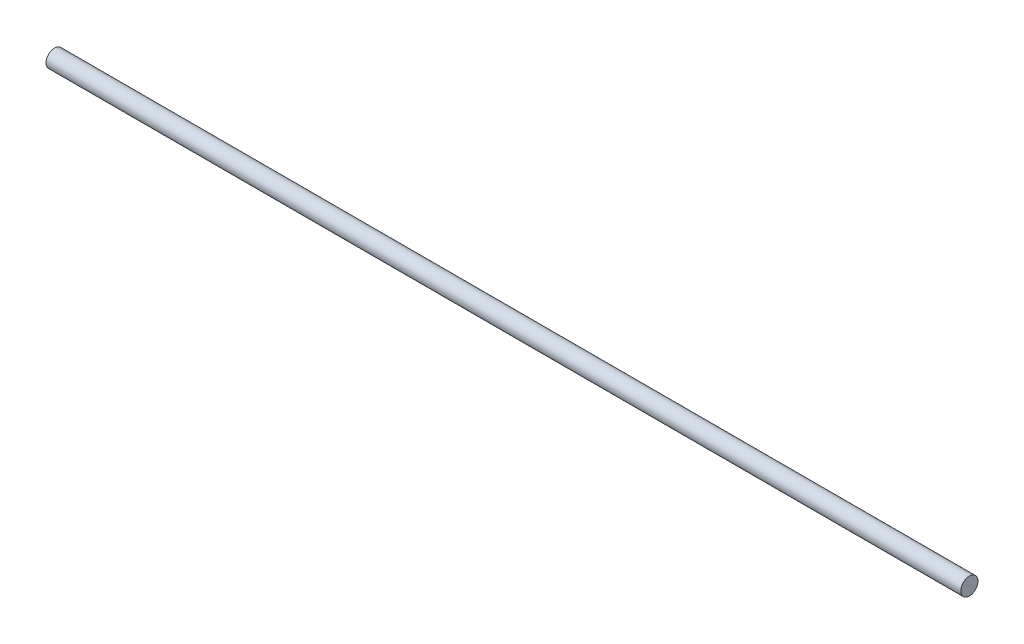
ISO-10303-21;
HEADER;
FILE_DESCRIPTION(('STEP AP214'),'2;1');
FILE_NAME('part.step','',(''),(''),'','','');
FILE_SCHEMA(('AUTOMOTIVE_DESIGN { 1 0 10303 214 1 1 1 1 }'));
ENDSEC;
DATA;
#1=APPLICATION_CONTEXT('core data for automotive mechanical design processes');
#2=APPLICATION_PROTOCOL_DEFINITION('international standard','automotive_design',2000,#1);
#3=PRODUCT_CONTEXT('',#1,'mechanical');
#4=PRODUCT('Part','Part','',(#3));
#5=PRODUCT_RELATED_PRODUCT_CATEGORY('part','',(#4));
#6=PRODUCT_DEFINITION_FORMATION('','',#4);
#7=PRODUCT_DEFINITION_CONTEXT('part definition',#1,'design');
#8=PRODUCT_DEFINITION('design','',#6,#7);
#9=PRODUCT_DEFINITION_SHAPE('','',#8);
#10=(LENGTH_UNIT() NAMED_UNIT(*) SI_UNIT(.MILLI.,.METRE.));
#11=(NAMED_UNIT(*) PLANE_ANGLE_UNIT() SI_UNIT($,.RADIAN.));
#12=(NAMED_UNIT(*) SI_UNIT($,.STERADIAN.) SOLID_ANGLE_UNIT());
#13=UNCERTAINTY_MEASURE_WITH_UNIT(LENGTH_MEASURE(1.E-05),#10,'distance_accuracy_value','');
#14=(GEOMETRIC_REPRESENTATION_CONTEXT(3) GLOBAL_UNCERTAINTY_ASSIGNED_CONTEXT((#13)) GLOBAL_UNIT_ASSIGNED_CONTEXT((#10,
#11,#12)) REPRESENTATION_CONTEXT('',''));
#15=CARTESIAN_POINT('',(0.,0.,0.));
#16=DIRECTION('',(0.,0.,1.));
#17=DIRECTION('',(1.,0.,0.));
#18=AXIS2_PLACEMENT_3D('',#15,#16,#17);
#19=CARTESIAN_POINT('',(403.969545343475,0.,0.));
#20=DIRECTION('',(-1.,0.,0.));
#21=DIRECTION('',(0.,0.,1.));
#22=AXIS2_PLACEMENT_3D('',#19,#20,#21);
#23=CYLINDRICAL_SURFACE('',#22,3.81);
#24=CARTESIAN_POINT('',(403.969545343475,0.,0.));
#25=DIRECTION('',(1.,0.,0.));
#26=DIRECTION('',(0.,0.,-1.));
#27=AXIS2_PLACEMENT_3D('',#24,#25,#26);
#28=CIRCLE('',#27,3.81);
#29=CARTESIAN_POINT('',(403.969545343475,0.,-3.81));
#30=VERTEX_POINT('',#29);
#31=EDGE_CURVE('E10',#30,#30,#28,.T.);
#32=ORIENTED_EDGE('',*,*,#31,.F.);
#33=EDGE_LOOP('',(#32));
#34=FACE_BOUND('',#33,.T.);
#35=CARTESIAN_POINT('',(0.,0.,0.));
#36=DIRECTION('',(1.,0.,0.));
#37=DIRECTION('',(0.,0.,-1.));
#38=AXIS2_PLACEMENT_3D('',#35,#36,#37);
#39=CIRCLE('',#38,3.81);
#40=CARTESIAN_POINT('',(0.,0.,-3.81));
#41=VERTEX_POINT('',#40);
#42=EDGE_CURVE('E48',#41,#41,#39,.T.);
#43=ORIENTED_EDGE('',*,*,#42,.T.);
#44=EDGE_LOOP('',(#43));
#45=FACE_BOUND('',#44,.T.);
#46=ADVANCED_FACE('F44',(#34,#45),#23,.T.);
#47=CARTESIAN_POINT('',(403.969545343475,0.,0.));
#48=DIRECTION('',(1.,0.,0.));
#49=DIRECTION('',(0.,0.,-1.));
#50=AXIS2_PLACEMENT_3D('',#47,#48,#49);
#51=PLANE('',#50);
#52=ORIENTED_EDGE('',*,*,#31,.T.);
#53=EDGE_LOOP('',(#52));
#54=FACE_BOUND('',#53,.T.);
#55=ADVANCED_FACE('F62',(#54),#51,.T.);
#56=CARTESIAN_POINT('',(0.,0.,0.));
#57=DIRECTION('',(1.,0.,0.));
#58=DIRECTION('',(0.,0.,-1.));
#59=AXIS2_PLACEMENT_3D('',#56,#57,#58);
#60=PLANE('',#59);
#61=ORIENTED_EDGE('',*,*,#42,.F.);
#62=EDGE_LOOP('',(#61));
#63=FACE_BOUND('',#62,.T.);
#64=ADVANCED_FACE('F58',(#63),#60,.F.);
#65=CLOSED_SHELL('',(#46,#55,#64));
#66=MANIFOLD_SOLID_BREP('B2',#65);
#67=ADVANCED_BREP_SHAPE_REPRESENTATION('',(#18,#66),#14);
#68=SHAPE_DEFINITION_REPRESENTATION(#9,#67);
ENDSEC;
END-ISO-10303-21;
